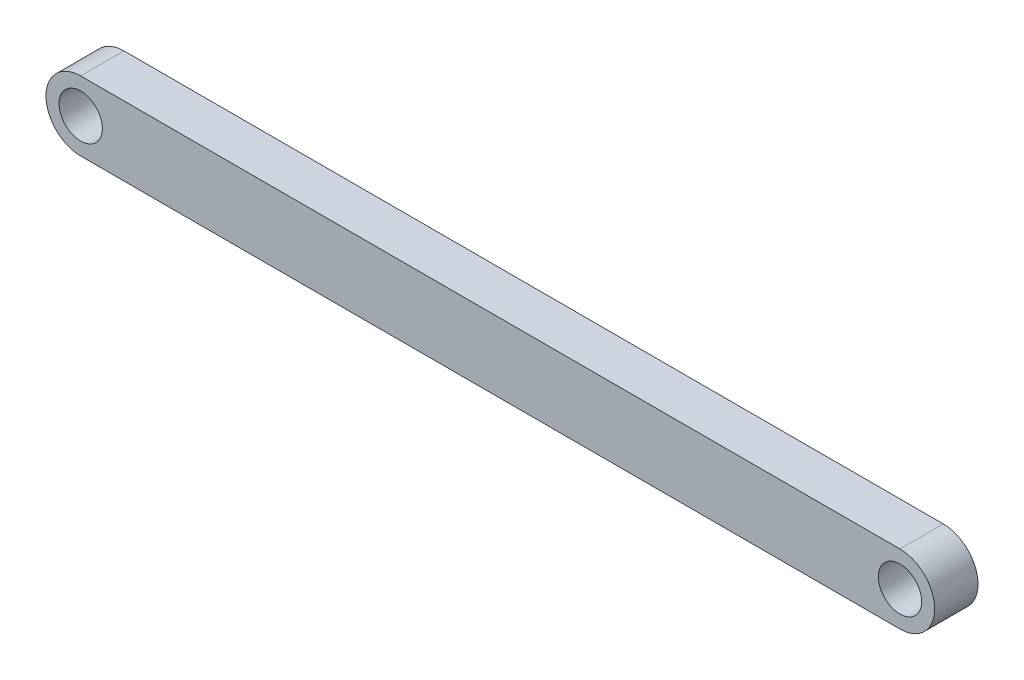
ISO-10303-21;
HEADER;
FILE_DESCRIPTION(('STEP AP214'),'2;1');
FILE_NAME('part.step','',(''),(''),'','','');
FILE_SCHEMA(('AUTOMOTIVE_DESIGN { 1 0 10303 214 1 1 1 1 }'));
ENDSEC;
DATA;
#1=APPLICATION_CONTEXT('core data for automotive mechanical design processes');
#2=APPLICATION_PROTOCOL_DEFINITION('international standard','automotive_design',2000,#1);
#3=PRODUCT_CONTEXT('',#1,'mechanical');
#4=PRODUCT('Part','Part','',(#3));
#5=PRODUCT_RELATED_PRODUCT_CATEGORY('part','',(#4));
#6=PRODUCT_DEFINITION_FORMATION('','',#4);
#7=PRODUCT_DEFINITION_CONTEXT('part definition',#1,'design');
#8=PRODUCT_DEFINITION('design','',#6,#7);
#9=PRODUCT_DEFINITION_SHAPE('','',#8);
#10=(LENGTH_UNIT() NAMED_UNIT(*) SI_UNIT(.MILLI.,.METRE.));
#11=(NAMED_UNIT(*) PLANE_ANGLE_UNIT() SI_UNIT($,.RADIAN.));
#12=(NAMED_UNIT(*) SI_UNIT($,.STERADIAN.) SOLID_ANGLE_UNIT());
#13=UNCERTAINTY_MEASURE_WITH_UNIT(LENGTH_MEASURE(1.E-05),#10,'distance_accuracy_value','');
#14=(GEOMETRIC_REPRESENTATION_CONTEXT(3) GLOBAL_UNCERTAINTY_ASSIGNED_CONTEXT((#13)) GLOBAL_UNIT_ASSIGNED_CONTEXT((#10,
#11,#12)) REPRESENTATION_CONTEXT('',''));
#15=CARTESIAN_POINT('',(0.,0.,0.));
#16=DIRECTION('',(0.,0.,1.));
#17=DIRECTION('',(1.,0.,0.));
#18=AXIS2_PLACEMENT_3D('',#15,#16,#17);
#19=CARTESIAN_POINT('',(-94.5,0.,5.));
#20=DIRECTION('',(0.,0.,1.));
#21=DIRECTION('',(1.,0.,0.));
#22=AXIS2_PLACEMENT_3D('',#19,#20,#21);
#23=PLANE('',#22);
#24=CARTESIAN_POINT('',(-94.5,0.,5.));
#25=DIRECTION('',(0.,0.,1.));
#26=DIRECTION('',(1.,0.,0.));
#27=AXIS2_PLACEMENT_3D('',#24,#25,#26);
#28=CIRCLE('',#27,5.);
#29=CARTESIAN_POINT('',(-89.5,0.,5.));
#30=VERTEX_POINT('',#29);
#31=EDGE_CURVE('E157',#30,#30,#28,.T.);
#32=ORIENTED_EDGE('',*,*,#31,.F.);
#33=EDGE_LOOP('',(#32));
#34=FACE_BOUND('',#33,.T.);
#35=CARTESIAN_POINT('',(-94.5,0.,5.));
#36=DIRECTION('',(0.,0.,1.));
#37=DIRECTION('',(1.,0.,0.));
#38=AXIS2_PLACEMENT_3D('',#35,#36,#37);
#39=CIRCLE('',#38,8.);
#40=CARTESIAN_POINT('',(-94.5,8.,5.));
#41=VERTEX_POINT('',#40);
#42=CARTESIAN_POINT('',(-94.5,-8.,5.));
#43=VERTEX_POINT('',#42);
#44=EDGE_CURVE('E163',#41,#43,#39,.T.);
#45=ORIENTED_EDGE('',*,*,#44,.T.);
#46=DIRECTION('',(1.,0.,0.));
#47=VECTOR('',#46,1.);
#48=CARTESIAN_POINT('',(-94.5,-8.,5.));
#49=LINE('',#48,#47);
#50=CARTESIAN_POINT('',(94.5,-7.99999999999997,5.));
#51=VERTEX_POINT('',#50);
#52=EDGE_CURVE('E90',#43,#51,#49,.T.);
#53=ORIENTED_EDGE('',*,*,#52,.T.);
#54=CARTESIAN_POINT('',(94.5,0.,5.));
#55=DIRECTION('',(0.,0.,1.));
#56=DIRECTION('',(1.,0.,0.));
#57=AXIS2_PLACEMENT_3D('',#54,#55,#56);
#58=CIRCLE('',#57,8.);
#59=CARTESIAN_POINT('',(94.5,8.00000000000004,5.));
#60=VERTEX_POINT('',#59);
#61=EDGE_CURVE('E166',#51,#60,#58,.T.);
#62=ORIENTED_EDGE('',*,*,#61,.T.);
#63=DIRECTION('',(-1.,0.,0.));
#64=VECTOR('',#63,1.);
#65=CARTESIAN_POINT('',(-94.5,8.,5.));
#66=LINE('',#65,#64);
#67=EDGE_CURVE('E62',#60,#41,#66,.T.);
#68=ORIENTED_EDGE('',*,*,#67,.T.);
#69=EDGE_LOOP('',(#45,#53,#62,#68));
#70=FACE_BOUND('',#69,.T.);
#71=CARTESIAN_POINT('',(94.5,0.,5.));
#72=DIRECTION('',(0.,0.,1.));
#73=DIRECTION('',(-1.,0.,0.));
#74=AXIS2_PLACEMENT_3D('',#71,#72,#73);
#75=CIRCLE('',#74,5.);
#76=CARTESIAN_POINT('',(89.5,0.,5.));
#77=VERTEX_POINT('',#76);
#78=EDGE_CURVE('E151',#77,#77,#75,.T.);
#79=ORIENTED_EDGE('',*,*,#78,.F.);
#80=EDGE_LOOP('',(#79));
#81=FACE_BOUND('',#80,.T.);
#82=ADVANCED_FACE('F38',(#34,#70,#81),#23,.T.);
#83=CARTESIAN_POINT('',(-94.5,0.,-5.));
#84=DIRECTION('',(0.,0.,1.));
#85=DIRECTION('',(1.,0.,0.));
#86=AXIS2_PLACEMENT_3D('',#83,#84,#85);
#87=PLANE('',#86);
#88=CARTESIAN_POINT('',(-74.5,0.,-5.));
#89=DIRECTION('',(0.,0.,-1.));
#90=DIRECTION('',(-1.,0.,0.));
#91=AXIS2_PLACEMENT_3D('',#88,#89,#90);
#92=CIRCLE('',#91,4.00000000000003);
#93=CARTESIAN_POINT('',(-74.5,-4.00000000000001,-5.));
#94=VERTEX_POINT('',#93);
#95=CARTESIAN_POINT('',(-74.5,4.00000000000006,-5.));
#96=VERTEX_POINT('',#95);
#97=EDGE_CURVE('E136',#94,#96,#92,.T.);
#98=ORIENTED_EDGE('',*,*,#97,.F.);
#99=DIRECTION('',(-1.,0.,0.));
#100=VECTOR('',#99,1.);
#101=CARTESIAN_POINT('',(74.5,-4.00000000000003,-5.));
#102=LINE('',#101,#100);
#103=CARTESIAN_POINT('',(74.5,-4.00000000000003,-5.));
#104=VERTEX_POINT('',#103);
#105=EDGE_CURVE('E129',#104,#94,#102,.T.);
#106=ORIENTED_EDGE('',*,*,#105,.F.);
#107=CARTESIAN_POINT('',(74.5,0.,-5.));
#108=DIRECTION('',(0.,0.,-1.));
#109=DIRECTION('',(-1.,0.,0.));
#110=AXIS2_PLACEMENT_3D('',#107,#108,#109);
#111=CIRCLE('',#110,4.00000000000003);
#112=CARTESIAN_POINT('',(74.5,4.00000000000003,-5.));
#113=VERTEX_POINT('',#112);
#114=EDGE_CURVE('E140',#113,#104,#111,.T.);
#115=ORIENTED_EDGE('',*,*,#114,.F.);
#116=DIRECTION('',(1.,0.,0.));
#117=VECTOR('',#116,1.);
#118=CARTESIAN_POINT('',(74.5,4.00000000000003,-5.));
#119=LINE('',#118,#117);
#120=EDGE_CURVE('E53',#96,#113,#119,.T.);
#121=ORIENTED_EDGE('',*,*,#120,.F.);
#122=EDGE_LOOP('',(#98,#106,#115,#121));
#123=FACE_BOUND('',#122,.T.);
#124=CARTESIAN_POINT('',(-94.5,0.,-5.));
#125=DIRECTION('',(0.,0.,1.));
#126=DIRECTION('',(1.,0.,0.));
#127=AXIS2_PLACEMENT_3D('',#124,#125,#126);
#128=CIRCLE('',#127,8.);
#129=CARTESIAN_POINT('',(-94.5,8.,-5.));
#130=VERTEX_POINT('',#129);
#131=CARTESIAN_POINT('',(-94.5,-8.,-5.));
#132=VERTEX_POINT('',#131);
#133=EDGE_CURVE('E160',#130,#132,#128,.T.);
#134=ORIENTED_EDGE('',*,*,#133,.F.);
#135=DIRECTION('',(-1.,0.,0.));
#136=VECTOR('',#135,1.);
#137=CARTESIAN_POINT('',(-94.5,8.,-5.));
#138=LINE('',#137,#136);
#139=CARTESIAN_POINT('',(94.5,8.00000000000004,-5.));
#140=VERTEX_POINT('',#139);
#141=EDGE_CURVE('E83',#140,#130,#138,.T.);
#142=ORIENTED_EDGE('',*,*,#141,.F.);
#143=CARTESIAN_POINT('',(94.5,0.,-5.));
#144=DIRECTION('',(0.,0.,1.));
#145=DIRECTION('',(1.,0.,0.));
#146=AXIS2_PLACEMENT_3D('',#143,#144,#145);
#147=CIRCLE('',#146,8.);
#148=CARTESIAN_POINT('',(94.5,-7.99999999999997,-5.));
#149=VERTEX_POINT('',#148);
#150=EDGE_CURVE('E174',#149,#140,#147,.T.);
#151=ORIENTED_EDGE('',*,*,#150,.F.);
#152=DIRECTION('',(1.,0.,0.));
#153=VECTOR('',#152,1.);
#154=CARTESIAN_POINT('',(-94.5,-8.,-5.));
#155=LINE('',#154,#153);
#156=EDGE_CURVE('E172',#132,#149,#155,.T.);
#157=ORIENTED_EDGE('',*,*,#156,.F.);
#158=EDGE_LOOP('',(#134,#142,#151,#157));
#159=FACE_BOUND('',#158,.T.);
#160=CARTESIAN_POINT('',(-94.5,0.,-5.));
#161=DIRECTION('',(0.,0.,1.));
#162=DIRECTION('',(1.,0.,0.));
#163=AXIS2_PLACEMENT_3D('',#160,#161,#162);
#164=CIRCLE('',#163,5.);
#165=CARTESIAN_POINT('',(-89.5,0.,-5.));
#166=VERTEX_POINT('',#165);
#167=EDGE_CURVE('E154',#166,#166,#164,.T.);
#168=ORIENTED_EDGE('',*,*,#167,.T.);
#169=EDGE_LOOP('',(#168));
#170=FACE_BOUND('',#169,.T.);
#171=CARTESIAN_POINT('',(94.5,0.,-5.));
#172=DIRECTION('',(0.,0.,1.));
#173=DIRECTION('',(-1.,0.,0.));
#174=AXIS2_PLACEMENT_3D('',#171,#172,#173);
#175=CIRCLE('',#174,5.);
#176=CARTESIAN_POINT('',(89.5,0.,-5.));
#177=VERTEX_POINT('',#176);
#178=EDGE_CURVE('E150',#177,#177,#175,.T.);
#179=ORIENTED_EDGE('',*,*,#178,.T.);
#180=EDGE_LOOP('',(#179));
#181=FACE_BOUND('',#180,.T.);
#182=ADVANCED_FACE('F187',(#123,#159,#170,#181),#87,.F.);
#183=CARTESIAN_POINT('',(-94.5,0.,5.));
#184=DIRECTION('',(0.,0.,-1.));
#185=DIRECTION('',(-1.,0.,0.));
#186=AXIS2_PLACEMENT_3D('',#183,#184,#185);
#187=CYLINDRICAL_SURFACE('',#186,8.);
#188=ORIENTED_EDGE('',*,*,#133,.T.);
#189=DIRECTION('',(0.,0.,-1.));
#190=VECTOR('',#189,1.);
#191=CARTESIAN_POINT('',(-94.5,-8.,5.));
#192=LINE('',#191,#190);
#193=EDGE_CURVE('E12',#43,#132,#192,.T.);
#194=ORIENTED_EDGE('',*,*,#193,.F.);
#195=ORIENTED_EDGE('',*,*,#44,.F.);
#196=DIRECTION('',(0.,0.,-1.));
#197=VECTOR('',#196,1.);
#198=CARTESIAN_POINT('',(-94.5,8.,5.));
#199=LINE('',#198,#197);
#200=EDGE_CURVE('E169',#41,#130,#199,.T.);
#201=ORIENTED_EDGE('',*,*,#200,.T.);
#202=EDGE_LOOP('',(#188,#194,#195,#201));
#203=FACE_BOUND('',#202,.T.);
#204=ADVANCED_FACE('F40',(#203),#187,.T.);
#205=CARTESIAN_POINT('',(-94.5,-8.,5.));
#206=DIRECTION('',(0.,1.,0.));
#207=DIRECTION('',(-1.,0.,0.));
#208=AXIS2_PLACEMENT_3D('',#205,#206,#207);
#209=PLANE('',#208);
#210=ORIENTED_EDGE('',*,*,#156,.T.);
#211=DIRECTION('',(0.,0.,-1.));
#212=VECTOR('',#211,1.);
#213=CARTESIAN_POINT('',(94.5,-7.99999999999997,5.));
#214=LINE('',#213,#212);
#215=EDGE_CURVE('E46',#51,#149,#214,.T.);
#216=ORIENTED_EDGE('',*,*,#215,.F.);
#217=ORIENTED_EDGE('',*,*,#52,.F.);
#218=ORIENTED_EDGE('',*,*,#193,.T.);
#219=EDGE_LOOP('',(#210,#216,#217,#218));
#220=FACE_BOUND('',#219,.T.);
#221=ADVANCED_FACE('F203',(#220),#209,.F.);
#222=CARTESIAN_POINT('',(94.5,0.,5.));
#223=DIRECTION('',(0.,0.,-1.));
#224=DIRECTION('',(-1.,0.,0.));
#225=AXIS2_PLACEMENT_3D('',#222,#223,#224);
#226=CYLINDRICAL_SURFACE('',#225,8.);
#227=ORIENTED_EDGE('',*,*,#150,.T.);
#228=DIRECTION('',(0.,0.,-1.));
#229=VECTOR('',#228,1.);
#230=CARTESIAN_POINT('',(94.5,8.00000000000004,5.));
#231=LINE('',#230,#229);
#232=EDGE_CURVE('E178',#60,#140,#231,.T.);
#233=ORIENTED_EDGE('',*,*,#232,.F.);
#234=ORIENTED_EDGE('',*,*,#61,.F.);
#235=ORIENTED_EDGE('',*,*,#215,.T.);
#236=EDGE_LOOP('',(#227,#233,#234,#235));
#237=FACE_BOUND('',#236,.T.);
#238=ADVANCED_FACE('F183',(#237),#226,.T.);
#239=CARTESIAN_POINT('',(-94.5,8.,5.));
#240=DIRECTION('',(0.,-1.,0.));
#241=DIRECTION('',(1.,0.,0.));
#242=AXIS2_PLACEMENT_3D('',#239,#240,#241);
#243=PLANE('',#242);
#244=ORIENTED_EDGE('',*,*,#141,.T.);
#245=ORIENTED_EDGE('',*,*,#200,.F.);
#246=ORIENTED_EDGE('',*,*,#67,.F.);
#247=ORIENTED_EDGE('',*,*,#232,.T.);
#248=EDGE_LOOP('',(#244,#245,#246,#247));
#249=FACE_BOUND('',#248,.T.);
#250=ADVANCED_FACE('F192',(#249),#243,.F.);
#251=CARTESIAN_POINT('',(-94.5,0.,5.));
#252=DIRECTION('',(0.,0.,-1.));
#253=DIRECTION('',(-1.,0.,0.));
#254=AXIS2_PLACEMENT_3D('',#251,#252,#253);
#255=CYLINDRICAL_SURFACE('',#254,5.);
#256=ORIENTED_EDGE('',*,*,#31,.T.);
#257=EDGE_LOOP('',(#256));
#258=FACE_BOUND('',#257,.T.);
#259=ORIENTED_EDGE('',*,*,#167,.F.);
#260=EDGE_LOOP('',(#259));
#261=FACE_BOUND('',#260,.T.);
#262=ADVANCED_FACE('F194',(#258,#261),#255,.F.);
#263=CARTESIAN_POINT('',(94.5,0.,5.));
#264=DIRECTION('',(0.,0.,-1.));
#265=DIRECTION('',(-1.,0.,0.));
#266=AXIS2_PLACEMENT_3D('',#263,#264,#265);
#267=CYLINDRICAL_SURFACE('',#266,5.);
#268=ORIENTED_EDGE('',*,*,#78,.T.);
#269=EDGE_LOOP('',(#268));
#270=FACE_BOUND('',#269,.T.);
#271=ORIENTED_EDGE('',*,*,#178,.F.);
#272=EDGE_LOOP('',(#271));
#273=FACE_BOUND('',#272,.T.);
#274=ADVANCED_FACE('F200',(#270,#273),#267,.F.);
#275=CARTESIAN_POINT('',(-94.5,0.,1.));
#276=DIRECTION('',(0.,0.,1.));
#277=DIRECTION('',(1.,0.,0.));
#278=AXIS2_PLACEMENT_3D('',#275,#276,#277);
#279=PLANE('',#278);
#280=CARTESIAN_POINT('',(74.5,0.,1.));
#281=DIRECTION('',(0.,0.,1.));
#282=DIRECTION('',(1.,0.,0.));
#283=AXIS2_PLACEMENT_3D('',#280,#281,#282);
#284=CIRCLE('',#283,4.00000000000003);
#285=CARTESIAN_POINT('',(74.5,4.00000000000003,1.));
#286=VERTEX_POINT('',#285);
#287=CARTESIAN_POINT('',(74.5,-4.00000000000003,1.));
#288=VERTEX_POINT('',#287);
#289=EDGE_CURVE('E133',#286,#288,#284,.F.);
#290=ORIENTED_EDGE('',*,*,#289,.T.);
#291=DIRECTION('',(-1.,0.,0.));
#292=VECTOR('',#291,1.);
#293=CARTESIAN_POINT('',(74.5,-4.00000000000003,1.));
#294=LINE('',#293,#292);
#295=CARTESIAN_POINT('',(-74.5,-4.00000000000001,1.));
#296=VERTEX_POINT('',#295);
#297=EDGE_CURVE('E126',#288,#296,#294,.T.);
#298=ORIENTED_EDGE('',*,*,#297,.T.);
#299=CARTESIAN_POINT('',(-74.5,0.,1.));
#300=DIRECTION('',(0.,0.,1.));
#301=DIRECTION('',(1.,0.,0.));
#302=AXIS2_PLACEMENT_3D('',#299,#300,#301);
#303=CIRCLE('',#302,4.00000000000003);
#304=CARTESIAN_POINT('',(-74.5,4.00000000000006,1.));
#305=VERTEX_POINT('',#304);
#306=EDGE_CURVE('E113',#296,#305,#303,.F.);
#307=ORIENTED_EDGE('',*,*,#306,.T.);
#308=DIRECTION('',(1.,0.,0.));
#309=VECTOR('',#308,1.);
#310=CARTESIAN_POINT('',(74.5,4.00000000000003,1.));
#311=LINE('',#310,#309);
#312=EDGE_CURVE('E145',#305,#286,#311,.T.);
#313=ORIENTED_EDGE('',*,*,#312,.T.);
#314=EDGE_LOOP('',(#290,#298,#307,#313));
#315=FACE_BOUND('',#314,.T.);
#316=ADVANCED_FACE('F132',(#315),#279,.F.);
#317=CARTESIAN_POINT('',(74.5,-4.00000000000003,162.203689524133));
#318=DIRECTION('',(0.,-1.,0.));
#319=DIRECTION('',(1.,0.,0.));
#320=AXIS2_PLACEMENT_3D('',#317,#318,#319);
#321=PLANE('',#320);
#322=DIRECTION('',(0.,0.,-1.));
#323=VECTOR('',#322,1.);
#324=CARTESIAN_POINT('',(74.5,-4.00000000000003,162.203689524133));
#325=LINE('',#324,#323);
#326=EDGE_CURVE('E143',#288,#104,#325,.T.);
#327=ORIENTED_EDGE('',*,*,#326,.T.);
#328=ORIENTED_EDGE('',*,*,#105,.T.);
#329=DIRECTION('',(0.,0.,-1.));
#330=VECTOR('',#329,1.);
#331=CARTESIAN_POINT('',(-74.5,-4.00000000000001,162.203689524133));
#332=LINE('',#331,#330);
#333=EDGE_CURVE('E117',#296,#94,#332,.T.);
#334=ORIENTED_EDGE('',*,*,#333,.F.);
#335=ORIENTED_EDGE('',*,*,#297,.F.);
#336=EDGE_LOOP('',(#327,#328,#334,#335));
#337=FACE_BOUND('',#336,.T.);
#338=ADVANCED_FACE('F125',(#337),#321,.F.);
#339=CARTESIAN_POINT('',(-74.5,0.,162.203689524133));
#340=DIRECTION('',(0.,0.,-1.));
#341=DIRECTION('',(-1.,0.,0.));
#342=AXIS2_PLACEMENT_3D('',#339,#340,#341);
#343=CYLINDRICAL_SURFACE('',#342,4.00000000000003);
#344=ORIENTED_EDGE('',*,*,#333,.T.);
#345=ORIENTED_EDGE('',*,*,#97,.T.);
#346=DIRECTION('',(0.,0.,-1.));
#347=VECTOR('',#346,1.);
#348=CARTESIAN_POINT('',(-74.5,4.00000000000006,162.203689524133));
#349=LINE('',#348,#347);
#350=EDGE_CURVE('E119',#305,#96,#349,.T.);
#351=ORIENTED_EDGE('',*,*,#350,.F.);
#352=ORIENTED_EDGE('',*,*,#306,.F.);
#353=EDGE_LOOP('',(#344,#345,#351,#352));
#354=FACE_BOUND('',#353,.T.);
#355=ADVANCED_FACE('F115',(#354),#343,.F.);
#356=CARTESIAN_POINT('',(74.5,4.00000000000003,162.203689524133));
#357=DIRECTION('',(0.,1.,0.));
#358=DIRECTION('',(-1.,0.,0.));
#359=AXIS2_PLACEMENT_3D('',#356,#357,#358);
#360=PLANE('',#359);
#361=ORIENTED_EDGE('',*,*,#350,.T.);
#362=ORIENTED_EDGE('',*,*,#120,.T.);
#363=DIRECTION('',(0.,0.,-1.));
#364=VECTOR('',#363,1.);
#365=CARTESIAN_POINT('',(74.5,4.00000000000003,162.203689524133));
#366=LINE('',#365,#364);
#367=EDGE_CURVE('E144',#286,#113,#366,.T.);
#368=ORIENTED_EDGE('',*,*,#367,.F.);
#369=ORIENTED_EDGE('',*,*,#312,.F.);
#370=EDGE_LOOP('',(#361,#362,#368,#369));
#371=FACE_BOUND('',#370,.T.);
#372=ADVANCED_FACE('F224',(#371),#360,.F.);
#373=CARTESIAN_POINT('',(74.5,0.,162.203689524133));
#374=DIRECTION('',(0.,0.,-1.));
#375=DIRECTION('',(-1.,0.,0.));
#376=AXIS2_PLACEMENT_3D('',#373,#374,#375);
#377=CYLINDRICAL_SURFACE('',#376,4.00000000000003);
#378=ORIENTED_EDGE('',*,*,#367,.T.);
#379=ORIENTED_EDGE('',*,*,#114,.T.);
#380=ORIENTED_EDGE('',*,*,#326,.F.);
#381=ORIENTED_EDGE('',*,*,#289,.F.);
#382=EDGE_LOOP('',(#378,#379,#380,#381));
#383=FACE_BOUND('',#382,.T.);
#384=ADVANCED_FACE('F227',(#383),#377,.F.);
#385=CLOSED_SHELL('',(#82,#182,#204,#221,#238,#250,#262,#274,#316,#338,#355,#372,#384));
#386=MANIFOLD_SOLID_BREP('B2',#385);
#387=ADVANCED_BREP_SHAPE_REPRESENTATION('',(#18,#386),#14);
#388=SHAPE_DEFINITION_REPRESENTATION(#9,#387);
ENDSEC;
END-ISO-10303-21;
